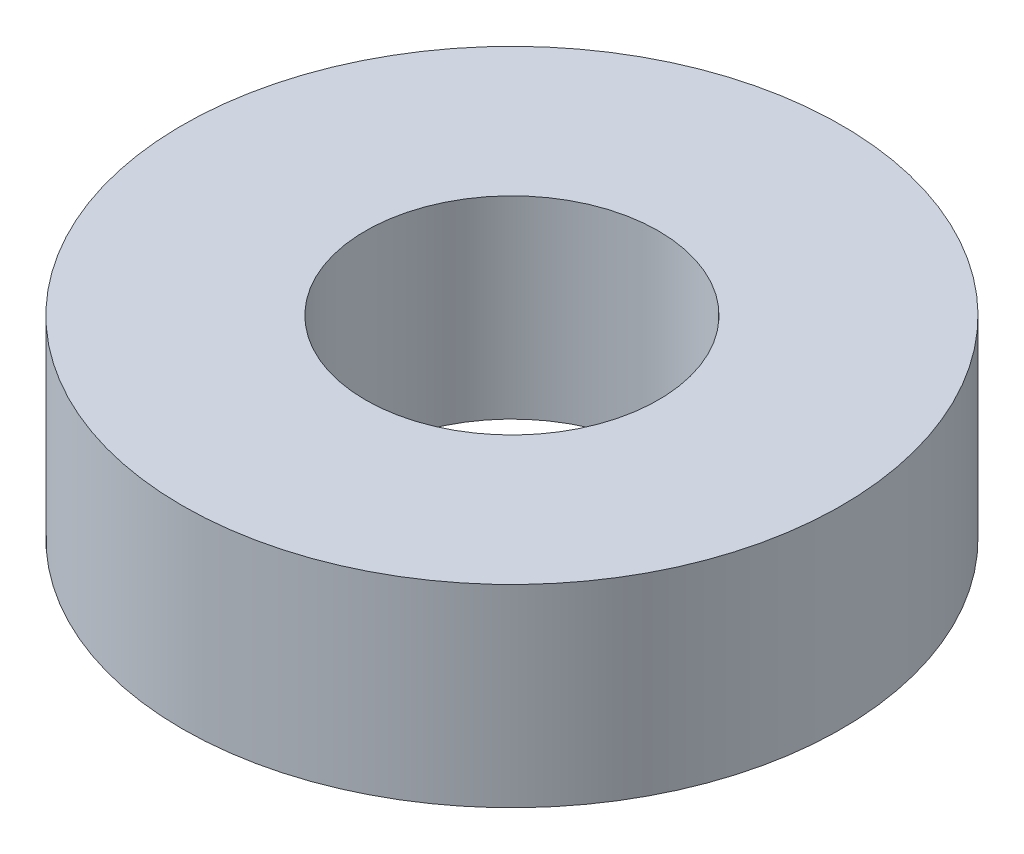
ISO-10303-21;
HEADER;
FILE_DESCRIPTION(('STEP AP214'),'2;1');
FILE_NAME('part.step','',(''),(''),'','','');
FILE_SCHEMA(('AUTOMOTIVE_DESIGN { 1 0 10303 214 1 1 1 1 }'));
ENDSEC;
DATA;
#1=APPLICATION_CONTEXT('core data for automotive mechanical design processes');
#2=APPLICATION_PROTOCOL_DEFINITION('international standard','automotive_design',2000,#1);
#3=PRODUCT_CONTEXT('',#1,'mechanical');
#4=PRODUCT('Part','Part','',(#3));
#5=PRODUCT_RELATED_PRODUCT_CATEGORY('part','',(#4));
#6=PRODUCT_DEFINITION_FORMATION('','',#4);
#7=PRODUCT_DEFINITION_CONTEXT('part definition',#1,'design');
#8=PRODUCT_DEFINITION('design','',#6,#7);
#9=PRODUCT_DEFINITION_SHAPE('','',#8);
#10=(LENGTH_UNIT() NAMED_UNIT(*) SI_UNIT(.MILLI.,.METRE.));
#11=(NAMED_UNIT(*) PLANE_ANGLE_UNIT() SI_UNIT($,.RADIAN.));
#12=(NAMED_UNIT(*) SI_UNIT($,.STERADIAN.) SOLID_ANGLE_UNIT());
#13=UNCERTAINTY_MEASURE_WITH_UNIT(LENGTH_MEASURE(1.E-05),#10,'distance_accuracy_value','');
#14=(GEOMETRIC_REPRESENTATION_CONTEXT(3) GLOBAL_UNCERTAINTY_ASSIGNED_CONTEXT((#13)) GLOBAL_UNIT_ASSIGNED_CONTEXT((#10,
#11,#12)) REPRESENTATION_CONTEXT('',''));
#15=CARTESIAN_POINT('',(0.,0.,0.));
#16=DIRECTION('',(0.,0.,1.));
#17=DIRECTION('',(1.,0.,0.));
#18=AXIS2_PLACEMENT_3D('',#15,#16,#17);
#19=CARTESIAN_POINT('',(-18.1560514253295,8.382,-3.65853629290489));
#20=DIRECTION('',(0.,1.,0.));
#21=DIRECTION('',(0.,0.,1.));
#22=AXIS2_PLACEMENT_3D('',#19,#20,#21);
#23=PLANE('',#22);
#24=CARTESIAN_POINT('',(-18.1560514253295,8.382,-3.65853629290489));
#25=DIRECTION('',(0.,1.,0.));
#26=DIRECTION('',(0.,0.,1.));
#27=AXIS2_PLACEMENT_3D('',#24,#25,#26);
#28=CIRCLE('',#27,14.2875);
#29=CARTESIAN_POINT('',(-18.1560514253295,8.382,10.6289637070951));
#30=VERTEX_POINT('',#29);
#31=EDGE_CURVE('E11',#30,#30,#28,.T.);
#32=ORIENTED_EDGE('',*,*,#31,.T.);
#33=EDGE_LOOP('',(#32));
#34=FACE_BOUND('',#33,.T.);
#35=CARTESIAN_POINT('',(-18.1560514253295,8.382,-3.65853629290489));
#36=DIRECTION('',(0.,1.,0.));
#37=DIRECTION('',(0.,0.,1.));
#38=AXIS2_PLACEMENT_3D('',#35,#36,#37);
#39=CIRCLE('',#38,6.35);
#40=CARTESIAN_POINT('',(-18.1560514253295,8.382,2.69146370709511));
#41=VERTEX_POINT('',#40);
#42=EDGE_CURVE('E58',#41,#41,#39,.T.);
#43=ORIENTED_EDGE('',*,*,#42,.F.);
#44=EDGE_LOOP('',(#43));
#45=FACE_BOUND('',#44,.T.);
#46=ADVANCED_FACE('F47',(#34,#45),#23,.T.);
#47=CARTESIAN_POINT('',(-18.1560514253295,0.,-3.65853629290489));
#48=DIRECTION('',(0.,1.,0.));
#49=DIRECTION('',(0.,0.,1.));
#50=AXIS2_PLACEMENT_3D('',#47,#48,#49);
#51=PLANE('',#50);
#52=CARTESIAN_POINT('',(-18.1560514253295,0.,-3.65853629290489));
#53=DIRECTION('',(0.,1.,0.));
#54=DIRECTION('',(0.,0.,1.));
#55=AXIS2_PLACEMENT_3D('',#52,#53,#54);
#56=CIRCLE('',#55,14.2875);
#57=CARTESIAN_POINT('',(-18.1560514253295,0.,10.6289637070951));
#58=VERTEX_POINT('',#57);
#59=EDGE_CURVE('E51',#58,#58,#56,.T.);
#60=ORIENTED_EDGE('',*,*,#59,.F.);
#61=EDGE_LOOP('',(#60));
#62=FACE_BOUND('',#61,.T.);
#63=CARTESIAN_POINT('',(-18.1560514253295,0.,-3.65853629290489));
#64=DIRECTION('',(0.,1.,0.));
#65=DIRECTION('',(0.,0.,1.));
#66=AXIS2_PLACEMENT_3D('',#63,#64,#65);
#67=CIRCLE('',#66,6.35);
#68=CARTESIAN_POINT('',(-18.1560514253295,0.,2.69146370709511));
#69=VERTEX_POINT('',#68);
#70=EDGE_CURVE('E60',#69,#69,#67,.T.);
#71=ORIENTED_EDGE('',*,*,#70,.T.);
#72=EDGE_LOOP('',(#71));
#73=FACE_BOUND('',#72,.T.);
#74=ADVANCED_FACE('F70',(#62,#73),#51,.F.);
#75=CARTESIAN_POINT('',(-18.1560514253295,8.382,-3.65853629290489));
#76=DIRECTION('',(0.,-1.,0.));
#77=DIRECTION('',(0.,0.,-1.));
#78=AXIS2_PLACEMENT_3D('',#75,#76,#77);
#79=CYLINDRICAL_SURFACE('',#78,14.2875);
#80=ORIENTED_EDGE('',*,*,#31,.F.);
#81=EDGE_LOOP('',(#80));
#82=FACE_BOUND('',#81,.T.);
#83=ORIENTED_EDGE('',*,*,#59,.T.);
#84=EDGE_LOOP('',(#83));
#85=FACE_BOUND('',#84,.T.);
#86=ADVANCED_FACE('F49',(#82,#85),#79,.T.);
#87=CARTESIAN_POINT('',(-18.1560514253295,8.382,-3.65853629290489));
#88=DIRECTION('',(0.,-1.,0.));
#89=DIRECTION('',(0.,0.,-1.));
#90=AXIS2_PLACEMENT_3D('',#87,#88,#89);
#91=CYLINDRICAL_SURFACE('',#90,6.35);
#92=ORIENTED_EDGE('',*,*,#42,.T.);
#93=EDGE_LOOP('',(#92));
#94=FACE_BOUND('',#93,.T.);
#95=ORIENTED_EDGE('',*,*,#70,.F.);
#96=EDGE_LOOP('',(#95));
#97=FACE_BOUND('',#96,.T.);
#98=ADVANCED_FACE('F66',(#94,#97),#91,.F.);
#99=CLOSED_SHELL('',(#46,#74,#86,#98));
#100=MANIFOLD_SOLID_BREP('B2',#99);
#101=ADVANCED_BREP_SHAPE_REPRESENTATION('',(#18,#100),#14);
#102=SHAPE_DEFINITION_REPRESENTATION(#9,#101);
ENDSEC;
END-ISO-10303-21;
